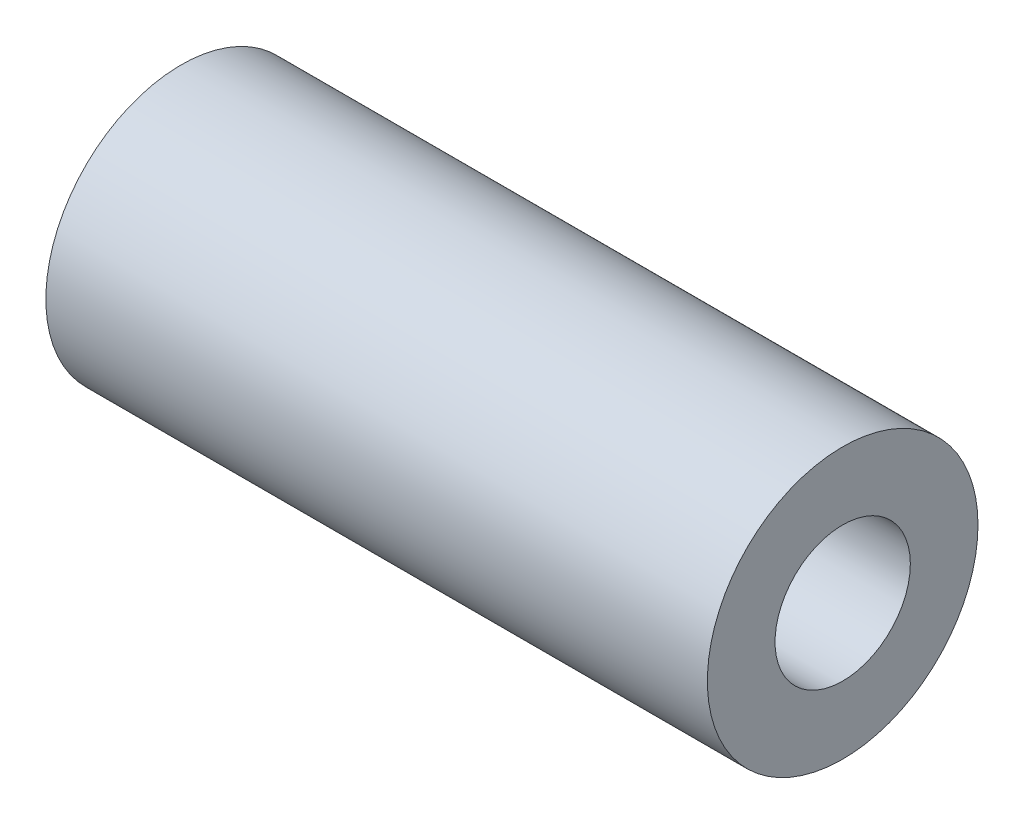
ISO-10303-21;
HEADER;
FILE_DESCRIPTION(('STEP AP214'),'2;1');
FILE_NAME('part.step','',(''),(''),'','','');
FILE_SCHEMA(('AUTOMOTIVE_DESIGN { 1 0 10303 214 1 1 1 1 }'));
ENDSEC;
DATA;
#1=APPLICATION_CONTEXT('core data for automotive mechanical design processes');
#2=APPLICATION_PROTOCOL_DEFINITION('international standard','automotive_design',2000,#1);
#3=PRODUCT_CONTEXT('',#1,'mechanical');
#4=PRODUCT('Part','Part','',(#3));
#5=PRODUCT_RELATED_PRODUCT_CATEGORY('part','',(#4));
#6=PRODUCT_DEFINITION_FORMATION('','',#4);
#7=PRODUCT_DEFINITION_CONTEXT('part definition',#1,'design');
#8=PRODUCT_DEFINITION('design','',#6,#7);
#9=PRODUCT_DEFINITION_SHAPE('','',#8);
#10=(LENGTH_UNIT() NAMED_UNIT(*) SI_UNIT(.MILLI.,.METRE.));
#11=(NAMED_UNIT(*) PLANE_ANGLE_UNIT() SI_UNIT($,.RADIAN.));
#12=(NAMED_UNIT(*) SI_UNIT($,.STERADIAN.) SOLID_ANGLE_UNIT());
#13=UNCERTAINTY_MEASURE_WITH_UNIT(LENGTH_MEASURE(1.E-05),#10,'distance_accuracy_value','');
#14=(GEOMETRIC_REPRESENTATION_CONTEXT(3) GLOBAL_UNCERTAINTY_ASSIGNED_CONTEXT((#13)) GLOBAL_UNIT_ASSIGNED_CONTEXT((#10,
#11,#12)) REPRESENTATION_CONTEXT('',''));
#15=CARTESIAN_POINT('',(0.,0.,0.));
#16=DIRECTION('',(0.,0.,1.));
#17=DIRECTION('',(1.,0.,0.));
#18=AXIS2_PLACEMENT_3D('',#15,#16,#17);
#19=CARTESIAN_POINT('',(11.,0.,0.));
#20=DIRECTION('',(-1.,0.,0.));
#21=DIRECTION('',(0.,0.,1.));
#22=AXIS2_PLACEMENT_3D('',#19,#20,#21);
#23=CYLINDRICAL_SURFACE('',#22,4.5);
#24=CARTESIAN_POINT('',(11.,0.,0.));
#25=DIRECTION('',(1.,0.,0.));
#26=DIRECTION('',(0.,0.,-1.));
#27=AXIS2_PLACEMENT_3D('',#24,#25,#26);
#28=CIRCLE('',#27,4.5);
#29=CARTESIAN_POINT('',(11.,0.,-4.5));
#30=VERTEX_POINT('',#29);
#31=EDGE_CURVE('E10',#30,#30,#28,.T.);
#32=ORIENTED_EDGE('',*,*,#31,.F.);
#33=EDGE_LOOP('',(#32));
#34=FACE_BOUND('',#33,.T.);
#35=CARTESIAN_POINT('',(-11.,0.,0.));
#36=DIRECTION('',(1.,0.,0.));
#37=DIRECTION('',(0.,0.,-1.));
#38=AXIS2_PLACEMENT_3D('',#35,#36,#37);
#39=CIRCLE('',#38,4.5);
#40=CARTESIAN_POINT('',(-11.,0.,-4.5));
#41=VERTEX_POINT('',#40);
#42=EDGE_CURVE('E33',#41,#41,#39,.T.);
#43=ORIENTED_EDGE('',*,*,#42,.T.);
#44=EDGE_LOOP('',(#43));
#45=FACE_BOUND('',#44,.T.);
#46=ADVANCED_FACE('F30',(#34,#45),#23,.T.);
#47=CARTESIAN_POINT('',(11.,0.,0.));
#48=DIRECTION('',(1.,0.,0.));
#49=DIRECTION('',(0.,0.,-1.));
#50=AXIS2_PLACEMENT_3D('',#47,#48,#49);
#51=PLANE('',#50);
#52=CARTESIAN_POINT('',(11.,0.,0.));
#53=DIRECTION('',(1.,0.,0.));
#54=DIRECTION('',(0.,0.,-1.));
#55=AXIS2_PLACEMENT_3D('',#52,#53,#54);
#56=CIRCLE('',#55,2.25);
#57=CARTESIAN_POINT('',(11.,0.,-2.25));
#58=VERTEX_POINT('',#57);
#59=EDGE_CURVE('E44',#58,#58,#56,.T.);
#60=ORIENTED_EDGE('',*,*,#59,.F.);
#61=EDGE_LOOP('',(#60));
#62=FACE_BOUND('',#61,.T.);
#63=ORIENTED_EDGE('',*,*,#31,.T.);
#64=EDGE_LOOP('',(#63));
#65=FACE_BOUND('',#64,.T.);
#66=ADVANCED_FACE('F50',(#62,#65),#51,.T.);
#67=CARTESIAN_POINT('',(-11.,0.,0.));
#68=DIRECTION('',(1.,0.,0.));
#69=DIRECTION('',(0.,0.,-1.));
#70=AXIS2_PLACEMENT_3D('',#67,#68,#69);
#71=PLANE('',#70);
#72=CARTESIAN_POINT('',(-11.,0.,0.));
#73=DIRECTION('',(1.,0.,0.));
#74=DIRECTION('',(0.,0.,-1.));
#75=AXIS2_PLACEMENT_3D('',#72,#73,#74);
#76=CIRCLE('',#75,2.25);
#77=CARTESIAN_POINT('',(-11.,0.,-2.25));
#78=VERTEX_POINT('',#77);
#79=EDGE_CURVE('E40',#78,#78,#76,.T.);
#80=ORIENTED_EDGE('',*,*,#79,.T.);
#81=EDGE_LOOP('',(#80));
#82=FACE_BOUND('',#81,.T.);
#83=ORIENTED_EDGE('',*,*,#42,.F.);
#84=EDGE_LOOP('',(#83));
#85=FACE_BOUND('',#84,.T.);
#86=ADVANCED_FACE('F52',(#82,#85),#71,.F.);
#87=CARTESIAN_POINT('',(11.,0.,0.));
#88=DIRECTION('',(1.,0.,0.));
#89=DIRECTION('',(0.,0.,-1.));
#90=AXIS2_PLACEMENT_3D('',#87,#88,#89);
#91=CYLINDRICAL_SURFACE('',#90,2.25);
#92=ORIENTED_EDGE('',*,*,#79,.F.);
#93=EDGE_LOOP('',(#92));
#94=FACE_BOUND('',#93,.T.);
#95=ORIENTED_EDGE('',*,*,#59,.T.);
#96=EDGE_LOOP('',(#95));
#97=FACE_BOUND('',#96,.T.);
#98=ADVANCED_FACE('F48',(#94,#97),#91,.F.);
#99=CLOSED_SHELL('',(#46,#66,#86,#98));
#100=MANIFOLD_SOLID_BREP('B2',#99);
#101=ADVANCED_BREP_SHAPE_REPRESENTATION('',(#18,#100),#14);
#102=SHAPE_DEFINITION_REPRESENTATION(#9,#101);
ENDSEC;
END-ISO-10303-21;
